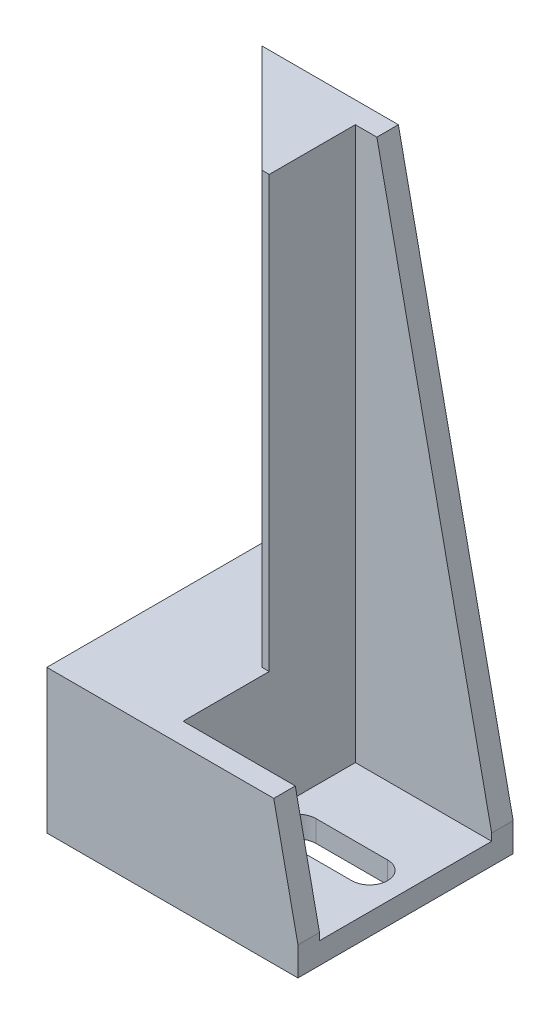
ISO-10303-21;
HEADER;
FILE_DESCRIPTION(('STEP AP214'),'2;1');
FILE_NAME('part.step','',(''),(''),'','','');
FILE_SCHEMA(('AUTOMOTIVE_DESIGN { 1 0 10303 214 1 1 1 1 }'));
ENDSEC;
DATA;
#1=APPLICATION_CONTEXT('core data for automotive mechanical design processes');
#2=APPLICATION_PROTOCOL_DEFINITION('international standard','automotive_design',2000,#1);
#3=PRODUCT_CONTEXT('',#1,'mechanical');
#4=PRODUCT('Part','Part','',(#3));
#5=PRODUCT_RELATED_PRODUCT_CATEGORY('part','',(#4));
#6=PRODUCT_DEFINITION_FORMATION('','',#4);
#7=PRODUCT_DEFINITION_CONTEXT('part definition',#1,'design');
#8=PRODUCT_DEFINITION('design','',#6,#7);
#9=PRODUCT_DEFINITION_SHAPE('','',#8);
#10=(LENGTH_UNIT() NAMED_UNIT(*) SI_UNIT(.MILLI.,.METRE.));
#11=(NAMED_UNIT(*) PLANE_ANGLE_UNIT() SI_UNIT($,.RADIAN.));
#12=(NAMED_UNIT(*) SI_UNIT($,.STERADIAN.) SOLID_ANGLE_UNIT());
#13=UNCERTAINTY_MEASURE_WITH_UNIT(LENGTH_MEASURE(1.E-05),#10,'distance_accuracy_value','');
#14=(GEOMETRIC_REPRESENTATION_CONTEXT(3) GLOBAL_UNCERTAINTY_ASSIGNED_CONTEXT((#13)) GLOBAL_UNIT_ASSIGNED_CONTEXT((#10,
#11,#12)) REPRESENTATION_CONTEXT('',''));
#15=CARTESIAN_POINT('',(0.,0.,0.));
#16=DIRECTION('',(0.,0.,1.));
#17=DIRECTION('',(1.,0.,0.));
#18=AXIS2_PLACEMENT_3D('',#15,#16,#17);
#19=CARTESIAN_POINT('',(-9.525,-26.9407683632074,9.525));
#20=DIRECTION('',(0.707106781186548,0.,-0.707106781186547));
#21=DIRECTION('',(-0.707106781186547,0.,-0.707106781186548));
#22=AXIS2_PLACEMENT_3D('',#19,#20,#21);
#23=PLANE('',#22);
#24=DIRECTION('',(0.707106781186547,0.,0.707106781186548));
#25=VECTOR('',#24,1.);
#26=CARTESIAN_POINT('',(-19.05,25.4,0.));
#27=LINE('',#26,#25);
#28=CARTESIAN_POINT('',(-19.05,25.4,0.));
#29=VERTEX_POINT('',#28);
#30=CARTESIAN_POINT('',(0.,25.4,19.05));
#31=VERTEX_POINT('',#30);
#32=EDGE_CURVE('E172',#29,#31,#27,.T.);
#33=ORIENTED_EDGE('',*,*,#32,.T.);
#34=DIRECTION('',(0.,1.,0.));
#35=VECTOR('',#34,1.);
#36=CARTESIAN_POINT('',(0.,-26.9407683632074,19.05));
#37=LINE('',#36,#35);
#38=CARTESIAN_POINT('',(0.,101.6,19.05));
#39=VERTEX_POINT('',#38);
#40=EDGE_CURVE('E205',#31,#39,#37,.T.);
#41=ORIENTED_EDGE('',*,*,#40,.T.);
#42=DIRECTION('',(-0.707106781186547,0.,-0.707106781186548));
#43=VECTOR('',#42,1.);
#44=CARTESIAN_POINT('',(-9.525,101.6,9.525));
#45=LINE('',#44,#43);
#46=CARTESIAN_POINT('',(-19.05,101.6,0.));
#47=VERTEX_POINT('',#46);
#48=EDGE_CURVE('E166',#39,#47,#45,.T.);
#49=ORIENTED_EDGE('',*,*,#48,.T.);
#50=DIRECTION('',(0.,1.,0.));
#51=VECTOR('',#50,1.);
#52=CARTESIAN_POINT('',(-19.05,-26.9407683632074,0.));
#53=LINE('',#52,#51);
#54=EDGE_CURVE('E204',#29,#47,#53,.T.);
#55=ORIENTED_EDGE('',*,*,#54,.F.);
#56=EDGE_LOOP('',(#33,#41,#49,#55));
#57=FACE_BOUND('',#56,.T.);
#58=ADVANCED_FACE('F35',(#57),#23,.F.);
#59=CARTESIAN_POINT('',(25.4,5.08,38.1));
#60=DIRECTION('',(-0.978549784986749,-0.206010481049842,0.));
#61=DIRECTION('',(0.206010481049842,-0.978549784986749,0.));
#62=AXIS2_PLACEMENT_3D('',#59,#60,#61);
#63=PLANE('',#62);
#64=DIRECTION('',(0.,0.,-1.));
#65=VECTOR('',#64,1.);
#66=CARTESIAN_POINT('',(5.08,101.6,38.1));
#67=LINE('',#66,#65);
#68=CARTESIAN_POINT('',(5.08000000000001,101.6,3.81));
#69=VERTEX_POINT('',#68);
#70=CARTESIAN_POINT('',(5.08,101.6,0.));
#71=VERTEX_POINT('',#70);
#72=EDGE_CURVE('E257',#69,#71,#67,.T.);
#73=ORIENTED_EDGE('',*,*,#72,.F.);
#74=DIRECTION('',(-0.206010481049842,0.978549784986749,0.));
#75=VECTOR('',#74,1.);
#76=CARTESIAN_POINT('',(25.4,5.08,3.81));
#77=LINE('',#76,#75);
#78=CARTESIAN_POINT('',(25.4,5.08,3.81));
#79=VERTEX_POINT('',#78);
#80=EDGE_CURVE('E243',#79,#69,#77,.T.);
#81=ORIENTED_EDGE('',*,*,#80,.F.);
#82=DIRECTION('',(0.,0.,-1.));
#83=VECTOR('',#82,1.);
#84=CARTESIAN_POINT('',(25.4,5.08,38.1));
#85=LINE('',#84,#83);
#86=CARTESIAN_POINT('',(25.4,5.08,0.));
#87=VERTEX_POINT('',#86);
#88=EDGE_CURVE('E267',#79,#87,#85,.T.);
#89=ORIENTED_EDGE('',*,*,#88,.T.);
#90=DIRECTION('',(-0.206010481049842,0.978549784986749,0.));
#91=VECTOR('',#90,1.);
#92=CARTESIAN_POINT('',(25.4,5.08,0.));
#93=LINE('',#92,#91);
#94=EDGE_CURVE('E262',#87,#71,#93,.T.);
#95=ORIENTED_EDGE('',*,*,#94,.T.);
#96=EDGE_LOOP('',(#73,#81,#89,#95));
#97=FACE_BOUND('',#96,.T.);
#98=ADVANCED_FACE('F274',(#97),#63,.F.);
#99=CARTESIAN_POINT('',(0.,3.81,38.1));
#100=DIRECTION('',(0.,1.,0.));
#101=DIRECTION('',(0.,0.,1.));
#102=AXIS2_PLACEMENT_3D('',#99,#100,#101);
#103=PLANE('',#102);
#104=DIRECTION('',(1.,0.,0.));
#105=VECTOR('',#104,1.);
#106=CARTESIAN_POINT('',(0.,3.81,3.81));
#107=LINE('',#106,#105);
#108=CARTESIAN_POINT('',(1.27,3.81,3.81));
#109=VERTEX_POINT('',#108);
#110=CARTESIAN_POINT('',(25.4,3.81,3.81));
#111=VERTEX_POINT('',#110);
#112=EDGE_CURVE('E241',#109,#111,#107,.T.);
#113=ORIENTED_EDGE('',*,*,#112,.F.);
#114=DIRECTION('',(0.,0.,-1.));
#115=VECTOR('',#114,1.);
#116=CARTESIAN_POINT('',(1.27,3.81,3.81));
#117=LINE('',#116,#115);
#118=CARTESIAN_POINT('',(1.27000000000001,3.81,34.29));
#119=VERTEX_POINT('',#118);
#120=EDGE_CURVE('E167',#119,#109,#117,.T.);
#121=ORIENTED_EDGE('',*,*,#120,.F.);
#122=DIRECTION('',(1.,0.,0.));
#123=VECTOR('',#122,1.);
#124=CARTESIAN_POINT('',(0.,3.81,34.29));
#125=LINE('',#124,#123);
#126=CARTESIAN_POINT('',(25.4,3.81,34.29));
#127=VERTEX_POINT('',#126);
#128=EDGE_CURVE('E244',#119,#127,#125,.T.);
#129=ORIENTED_EDGE('',*,*,#128,.T.);
#130=DIRECTION('',(0.,0.,1.));
#131=VECTOR('',#130,1.);
#132=CARTESIAN_POINT('',(25.4,3.81,3.81));
#133=LINE('',#132,#131);
#134=EDGE_CURVE('E181',#111,#127,#133,.T.);
#135=ORIENTED_EDGE('',*,*,#134,.F.);
#136=EDGE_LOOP('',(#113,#121,#129,#135));
#137=FACE_BOUND('',#136,.T.);
#138=CARTESIAN_POINT('',(6.35,3.81,19.05));
#139=DIRECTION('',(0.,1.,0.));
#140=DIRECTION('',(0.,0.,1.));
#141=AXIS2_PLACEMENT_3D('',#138,#139,#140);
#142=CIRCLE('',#141,3.175);
#143=CARTESIAN_POINT('',(6.35,3.81,22.225));
#144=VERTEX_POINT('',#143);
#145=CARTESIAN_POINT('',(6.35,3.81,15.875));
#146=VERTEX_POINT('',#145);
#147=EDGE_CURVE('E226',#144,#146,#142,.F.);
#148=ORIENTED_EDGE('',*,*,#147,.T.);
#149=DIRECTION('',(1.,0.,0.));
#150=VECTOR('',#149,1.);
#151=CARTESIAN_POINT('',(6.35,3.81,15.875));
#152=LINE('',#151,#150);
#153=CARTESIAN_POINT('',(19.05,3.81,15.875));
#154=VERTEX_POINT('',#153);
#155=EDGE_CURVE('E214',#146,#154,#152,.T.);
#156=ORIENTED_EDGE('',*,*,#155,.T.);
#157=CARTESIAN_POINT('',(19.05,3.81,19.05));
#158=DIRECTION('',(0.,1.,0.));
#159=DIRECTION('',(0.,0.,1.));
#160=AXIS2_PLACEMENT_3D('',#157,#158,#159);
#161=CIRCLE('',#160,3.175);
#162=CARTESIAN_POINT('',(19.05,3.81,22.225));
#163=VERTEX_POINT('',#162);
#164=EDGE_CURVE('E234',#154,#163,#161,.F.);
#165=ORIENTED_EDGE('',*,*,#164,.T.);
#166=DIRECTION('',(-1.,0.,0.));
#167=VECTOR('',#166,1.);
#168=CARTESIAN_POINT('',(6.35,3.81,22.225));
#169=LINE('',#168,#167);
#170=EDGE_CURVE('E230',#163,#144,#169,.T.);
#171=ORIENTED_EDGE('',*,*,#170,.T.);
#172=EDGE_LOOP('',(#148,#156,#165,#171));
#173=FACE_BOUND('',#172,.T.);
#174=ADVANCED_FACE('F312',(#137,#173),#103,.T.);
#175=DIRECTION('',(-0.206010481049842,0.978549784986749,0.));
#176=VECTOR('',#175,1.);
#177=CARTESIAN_POINT('',(25.4,5.08,34.29));
#178=LINE('',#177,#176);
#179=CARTESIAN_POINT('',(25.4,5.08,34.29));
#180=VERTEX_POINT('',#179);
#181=CARTESIAN_POINT('',(21.1221052631579,25.4,34.29));
#182=VERTEX_POINT('',#181);
#183=EDGE_CURVE('E246',#180,#182,#178,.T.);
#184=ORIENTED_EDGE('',*,*,#183,.T.);
#185=DIRECTION('',(0.,0.,1.));
#186=VECTOR('',#185,1.);
#187=CARTESIAN_POINT('',(21.1221052631579,25.4,38.1));
#188=LINE('',#187,#186);
#189=CARTESIAN_POINT('',(21.1221052631579,25.4,38.1));
#190=VERTEX_POINT('',#189);
#191=EDGE_CURVE('E176',#182,#190,#188,.T.);
#192=ORIENTED_EDGE('',*,*,#191,.T.);
#193=DIRECTION('',(-0.206010481049842,0.978549784986749,0.));
#194=VECTOR('',#193,1.);
#195=CARTESIAN_POINT('',(25.4,5.08,38.1));
#196=LINE('',#195,#194);
#197=CARTESIAN_POINT('',(25.4,5.08,38.1));
#198=VERTEX_POINT('',#197);
#199=EDGE_CURVE('E157',#198,#190,#196,.T.);
#200=ORIENTED_EDGE('',*,*,#199,.F.);
#201=EDGE_CURVE('E43',#198,#180,#85,.T.);
#202=ORIENTED_EDGE('',*,*,#201,.T.);
#203=EDGE_LOOP('',(#184,#192,#200,#202));
#204=FACE_BOUND('',#203,.T.);
#205=ADVANCED_FACE('F303',(#204),#63,.F.);
#206=CARTESIAN_POINT('',(0.,0.,38.1));
#207=DIRECTION('',(0.,1.,0.));
#208=DIRECTION('',(0.,0.,1.));
#209=AXIS2_PLACEMENT_3D('',#206,#207,#208);
#210=PLANE('',#209);
#211=CARTESIAN_POINT('',(19.05,0.,19.05));
#212=DIRECTION('',(0.,-1.,0.));
#213=DIRECTION('',(0.,0.,-1.));
#214=AXIS2_PLACEMENT_3D('',#211,#212,#213);
#215=CIRCLE('',#214,3.175);
#216=CARTESIAN_POINT('',(19.05,0.,15.875));
#217=VERTEX_POINT('',#216);
#218=CARTESIAN_POINT('',(19.05,0.,22.225));
#219=VERTEX_POINT('',#218);
#220=EDGE_CURVE('E215',#217,#219,#215,.T.);
#221=ORIENTED_EDGE('',*,*,#220,.F.);
#222=DIRECTION('',(1.,0.,0.));
#223=VECTOR('',#222,1.);
#224=CARTESIAN_POINT('',(6.35,0.,15.875));
#225=LINE('',#224,#223);
#226=CARTESIAN_POINT('',(6.35,0.,15.875));
#227=VERTEX_POINT('',#226);
#228=EDGE_CURVE('E218',#227,#217,#225,.T.);
#229=ORIENTED_EDGE('',*,*,#228,.F.);
#230=CARTESIAN_POINT('',(6.35,0.,19.05));
#231=DIRECTION('',(0.,-1.,0.));
#232=DIRECTION('',(0.,0.,-1.));
#233=AXIS2_PLACEMENT_3D('',#230,#231,#232);
#234=CIRCLE('',#233,3.175);
#235=CARTESIAN_POINT('',(6.35,0.,22.225));
#236=VERTEX_POINT('',#235);
#237=EDGE_CURVE('E208',#236,#227,#234,.T.);
#238=ORIENTED_EDGE('',*,*,#237,.F.);
#239=DIRECTION('',(-1.,0.,0.));
#240=VECTOR('',#239,1.);
#241=CARTESIAN_POINT('',(6.35,0.,22.225));
#242=LINE('',#241,#240);
#243=EDGE_CURVE('E212',#219,#236,#242,.T.);
#244=ORIENTED_EDGE('',*,*,#243,.F.);
#245=EDGE_LOOP('',(#221,#229,#238,#244));
#246=FACE_BOUND('',#245,.T.);
#247=DIRECTION('',(1.,0.,0.));
#248=VECTOR('',#247,1.);
#249=CARTESIAN_POINT('',(0.,0.,0.));
#250=LINE('',#249,#248);
#251=CARTESIAN_POINT('',(-19.05,0.,0.));
#252=VERTEX_POINT('',#251);
#253=CARTESIAN_POINT('',(25.4,0.,0.));
#254=VERTEX_POINT('',#253);
#255=EDGE_CURVE('E250',#252,#254,#250,.T.);
#256=ORIENTED_EDGE('',*,*,#255,.T.);
#257=DIRECTION('',(0.,0.,-1.));
#258=VECTOR('',#257,1.);
#259=CARTESIAN_POINT('',(25.4,0.,38.1));
#260=LINE('',#259,#258);
#261=CARTESIAN_POINT('',(25.4,0.,38.1));
#262=VERTEX_POINT('',#261);
#263=EDGE_CURVE('E11',#262,#254,#260,.T.);
#264=ORIENTED_EDGE('',*,*,#263,.F.);
#265=DIRECTION('',(1.,0.,0.));
#266=VECTOR('',#265,1.);
#267=CARTESIAN_POINT('',(0.,0.,38.1));
#268=LINE('',#267,#266);
#269=CARTESIAN_POINT('',(-19.05,0.,38.1));
#270=VERTEX_POINT('',#269);
#271=EDGE_CURVE('E251',#270,#262,#268,.T.);
#272=ORIENTED_EDGE('',*,*,#271,.F.);
#273=DIRECTION('',(0.,0.,-1.));
#274=VECTOR('',#273,1.);
#275=CARTESIAN_POINT('',(-19.05,0.,38.1));
#276=LINE('',#275,#274);
#277=EDGE_CURVE('E165',#270,#252,#276,.T.);
#278=ORIENTED_EDGE('',*,*,#277,.T.);
#279=EDGE_LOOP('',(#256,#264,#272,#278));
#280=FACE_BOUND('',#279,.T.);
#281=ADVANCED_FACE('F37',(#246,#280),#210,.F.);
#282=CARTESIAN_POINT('',(25.4,0.,38.1));
#283=DIRECTION('',(-1.,0.,0.));
#284=DIRECTION('',(0.,0.,1.));
#285=AXIS2_PLACEMENT_3D('',#282,#283,#284);
#286=PLANE('',#285);
#287=ORIENTED_EDGE('',*,*,#88,.F.);
#288=DIRECTION('',(0.,1.,0.));
#289=VECTOR('',#288,1.);
#290=CARTESIAN_POINT('',(25.4,-35.0652787771354,3.81));
#291=LINE('',#290,#289);
#292=EDGE_CURVE('E184',#111,#79,#291,.T.);
#293=ORIENTED_EDGE('',*,*,#292,.F.);
#294=ORIENTED_EDGE('',*,*,#134,.T.);
#295=DIRECTION('',(0.,1.,0.));
#296=VECTOR('',#295,1.);
#297=CARTESIAN_POINT('',(25.4,-35.0652787771354,34.29));
#298=LINE('',#297,#296);
#299=EDGE_CURVE('E192',#127,#180,#298,.T.);
#300=ORIENTED_EDGE('',*,*,#299,.T.);
#301=ORIENTED_EDGE('',*,*,#201,.F.);
#302=DIRECTION('',(0.,1.,0.));
#303=VECTOR('',#302,1.);
#304=CARTESIAN_POINT('',(25.4,0.,38.1));
#305=LINE('',#304,#303);
#306=EDGE_CURVE('E253',#262,#198,#305,.T.);
#307=ORIENTED_EDGE('',*,*,#306,.F.);
#308=ORIENTED_EDGE('',*,*,#263,.T.);
#309=DIRECTION('',(0.,1.,0.));
#310=VECTOR('',#309,1.);
#311=CARTESIAN_POINT('',(25.4,0.,0.));
#312=LINE('',#311,#310);
#313=EDGE_CURVE('E259',#254,#87,#312,.T.);
#314=ORIENTED_EDGE('',*,*,#313,.T.);
#315=EDGE_LOOP('',(#287,#293,#294,#300,#301,#307,#308,#314));
#316=FACE_BOUND('',#315,.T.);
#317=ADVANCED_FACE('F280',(#316),#286,.F.);
#318=CARTESIAN_POINT('',(5.08,101.6,38.1));
#319=DIRECTION('',(0.,-1.,0.));
#320=DIRECTION('',(0.,0.,-1.));
#321=AXIS2_PLACEMENT_3D('',#318,#319,#320);
#322=PLANE('',#321);
#323=ORIENTED_EDGE('',*,*,#48,.F.);
#324=DIRECTION('',(-1.,0.,0.));
#325=VECTOR('',#324,1.);
#326=CARTESIAN_POINT('',(-19.05,101.6,19.05));
#327=LINE('',#326,#325);
#328=CARTESIAN_POINT('',(1.27,101.6,19.05));
#329=VERTEX_POINT('',#328);
#330=EDGE_CURVE('E160',#329,#39,#327,.T.);
#331=ORIENTED_EDGE('',*,*,#330,.F.);
#332=DIRECTION('',(0.,0.,1.));
#333=VECTOR('',#332,1.);
#334=CARTESIAN_POINT('',(1.27,101.6,3.81));
#335=LINE('',#334,#333);
#336=CARTESIAN_POINT('',(1.27,101.6,3.81));
#337=VERTEX_POINT('',#336);
#338=EDGE_CURVE('E186',#337,#329,#335,.T.);
#339=ORIENTED_EDGE('',*,*,#338,.F.);
#340=DIRECTION('',(-1.,0.,0.));
#341=VECTOR('',#340,1.);
#342=CARTESIAN_POINT('',(25.4,101.6,3.81));
#343=LINE('',#342,#341);
#344=EDGE_CURVE('E174',#69,#337,#343,.T.);
#345=ORIENTED_EDGE('',*,*,#344,.F.);
#346=ORIENTED_EDGE('',*,*,#72,.T.);
#347=DIRECTION('',(-1.,0.,0.));
#348=VECTOR('',#347,1.);
#349=CARTESIAN_POINT('',(5.08,101.6,0.));
#350=LINE('',#349,#348);
#351=EDGE_CURVE('E254',#71,#47,#350,.T.);
#352=ORIENTED_EDGE('',*,*,#351,.T.);
#353=EDGE_LOOP('',(#323,#331,#339,#345,#346,#352));
#354=FACE_BOUND('',#353,.T.);
#355=ADVANCED_FACE('F287',(#354),#322,.F.);
#356=CARTESIAN_POINT('',(0.,0.,38.1));
#357=DIRECTION('',(0.,0.,1.));
#358=DIRECTION('',(1.,0.,0.));
#359=AXIS2_PLACEMENT_3D('',#356,#357,#358);
#360=PLANE('',#359);
#361=DIRECTION('',(1.,0.,0.));
#362=VECTOR('',#361,1.);
#363=CARTESIAN_POINT('',(-19.05,25.4,38.1));
#364=LINE('',#363,#362);
#365=CARTESIAN_POINT('',(-19.05,25.4,38.1));
#366=VERTEX_POINT('',#365);
#367=EDGE_CURVE('E152',#366,#190,#364,.T.);
#368=ORIENTED_EDGE('',*,*,#367,.F.);
#369=DIRECTION('',(0.,1.,0.));
#370=VECTOR('',#369,1.);
#371=CARTESIAN_POINT('',(-19.05,-26.9407683632074,38.1));
#372=LINE('',#371,#370);
#373=EDGE_CURVE('E154',#270,#366,#372,.T.);
#374=ORIENTED_EDGE('',*,*,#373,.F.);
#375=ORIENTED_EDGE('',*,*,#271,.T.);
#376=ORIENTED_EDGE('',*,*,#306,.T.);
#377=ORIENTED_EDGE('',*,*,#199,.T.);
#378=EDGE_LOOP('',(#368,#374,#375,#376,#377));
#379=FACE_BOUND('',#378,.T.);
#380=ADVANCED_FACE('F153',(#379),#360,.T.);
#381=CARTESIAN_POINT('',(0.,0.,0.));
#382=DIRECTION('',(0.,0.,1.));
#383=DIRECTION('',(1.,0.,0.));
#384=AXIS2_PLACEMENT_3D('',#381,#382,#383);
#385=PLANE('',#384);
#386=ORIENTED_EDGE('',*,*,#255,.F.);
#387=EDGE_CURVE('E209',#252,#29,#53,.T.);
#388=ORIENTED_EDGE('',*,*,#387,.T.);
#389=ORIENTED_EDGE('',*,*,#54,.T.);
#390=ORIENTED_EDGE('',*,*,#351,.F.);
#391=ORIENTED_EDGE('',*,*,#94,.F.);
#392=ORIENTED_EDGE('',*,*,#313,.F.);
#393=EDGE_LOOP('',(#386,#388,#389,#390,#391,#392));
#394=FACE_BOUND('',#393,.T.);
#395=ADVANCED_FACE('F284',(#394),#385,.F.);
#396=CARTESIAN_POINT('',(0.,0.,34.29));
#397=DIRECTION('',(0.,0.,1.));
#398=DIRECTION('',(1.,0.,0.));
#399=AXIS2_PLACEMENT_3D('',#396,#397,#398);
#400=PLANE('',#399);
#401=DIRECTION('',(0.,1.,0.));
#402=VECTOR('',#401,1.);
#403=CARTESIAN_POINT('',(1.27000000000001,-35.0652787771354,34.29));
#404=LINE('',#403,#402);
#405=CARTESIAN_POINT('',(1.27000000000001,25.4,34.29));
#406=VERTEX_POINT('',#405);
#407=EDGE_CURVE('E195',#119,#406,#404,.T.);
#408=ORIENTED_EDGE('',*,*,#407,.T.);
#409=DIRECTION('',(1.,0.,0.));
#410=VECTOR('',#409,1.);
#411=CARTESIAN_POINT('',(0.,25.4,34.29));
#412=LINE('',#411,#410);
#413=EDGE_CURVE('E300',#406,#182,#412,.T.);
#414=ORIENTED_EDGE('',*,*,#413,.T.);
#415=ORIENTED_EDGE('',*,*,#183,.F.);
#416=ORIENTED_EDGE('',*,*,#299,.F.);
#417=ORIENTED_EDGE('',*,*,#128,.F.);
#418=EDGE_LOOP('',(#408,#414,#415,#416,#417));
#419=FACE_BOUND('',#418,.T.);
#420=ADVANCED_FACE('F308',(#419),#400,.F.);
#421=CARTESIAN_POINT('',(0.,0.,3.81));
#422=DIRECTION('',(0.,0.,1.));
#423=DIRECTION('',(1.,0.,0.));
#424=AXIS2_PLACEMENT_3D('',#421,#422,#423);
#425=PLANE('',#424);
#426=DIRECTION('',(0.,1.,0.));
#427=VECTOR('',#426,1.);
#428=CARTESIAN_POINT('',(1.27,-35.0652787771354,3.81));
#429=LINE('',#428,#427);
#430=EDGE_CURVE('E189',#109,#337,#429,.T.);
#431=ORIENTED_EDGE('',*,*,#430,.F.);
#432=ORIENTED_EDGE('',*,*,#112,.T.);
#433=ORIENTED_EDGE('',*,*,#292,.T.);
#434=ORIENTED_EDGE('',*,*,#80,.T.);
#435=ORIENTED_EDGE('',*,*,#344,.T.);
#436=EDGE_LOOP('',(#431,#432,#433,#434,#435));
#437=FACE_BOUND('',#436,.T.);
#438=ADVANCED_FACE('F317',(#437),#425,.T.);
#439=CARTESIAN_POINT('',(6.35,23.8904631420692,15.875));
#440=DIRECTION('',(0.,0.,-1.));
#441=DIRECTION('',(-1.,0.,0.));
#442=AXIS2_PLACEMENT_3D('',#439,#440,#441);
#443=PLANE('',#442);
#444=DIRECTION('',(0.,-1.,0.));
#445=VECTOR('',#444,1.);
#446=CARTESIAN_POINT('',(6.35,23.8904631420692,15.875));
#447=LINE('',#446,#445);
#448=EDGE_CURVE('E228',#146,#227,#447,.T.);
#449=ORIENTED_EDGE('',*,*,#448,.T.);
#450=ORIENTED_EDGE('',*,*,#228,.T.);
#451=DIRECTION('',(0.,-1.,0.));
#452=VECTOR('',#451,1.);
#453=CARTESIAN_POINT('',(19.05,23.8904631420692,15.875));
#454=LINE('',#453,#452);
#455=EDGE_CURVE('E225',#154,#217,#454,.T.);
#456=ORIENTED_EDGE('',*,*,#455,.F.);
#457=ORIENTED_EDGE('',*,*,#155,.F.);
#458=EDGE_LOOP('',(#449,#450,#456,#457));
#459=FACE_BOUND('',#458,.T.);
#460=ADVANCED_FACE('F346',(#459),#443,.F.);
#461=CARTESIAN_POINT('',(19.05,23.8904631420692,19.05));
#462=DIRECTION('',(0.,-1.,0.));
#463=DIRECTION('',(0.,0.,-1.));
#464=AXIS2_PLACEMENT_3D('',#461,#462,#463);
#465=CYLINDRICAL_SURFACE('',#464,3.175);
#466=ORIENTED_EDGE('',*,*,#455,.T.);
#467=ORIENTED_EDGE('',*,*,#220,.T.);
#468=DIRECTION('',(0.,-1.,0.));
#469=VECTOR('',#468,1.);
#470=CARTESIAN_POINT('',(19.05,23.8904631420692,22.225));
#471=LINE('',#470,#469);
#472=EDGE_CURVE('E233',#163,#219,#471,.T.);
#473=ORIENTED_EDGE('',*,*,#472,.F.);
#474=ORIENTED_EDGE('',*,*,#164,.F.);
#475=EDGE_LOOP('',(#466,#467,#473,#474));
#476=FACE_BOUND('',#475,.T.);
#477=ADVANCED_FACE('F342',(#476),#465,.F.);
#478=CARTESIAN_POINT('',(6.35,23.8904631420692,22.225));
#479=DIRECTION('',(0.,0.,1.));
#480=DIRECTION('',(1.,0.,0.));
#481=AXIS2_PLACEMENT_3D('',#478,#479,#480);
#482=PLANE('',#481);
#483=ORIENTED_EDGE('',*,*,#472,.T.);
#484=ORIENTED_EDGE('',*,*,#243,.T.);
#485=DIRECTION('',(0.,-1.,0.));
#486=VECTOR('',#485,1.);
#487=CARTESIAN_POINT('',(6.35,23.8904631420692,22.225));
#488=LINE('',#487,#486);
#489=EDGE_CURVE('E229',#144,#236,#488,.T.);
#490=ORIENTED_EDGE('',*,*,#489,.F.);
#491=ORIENTED_EDGE('',*,*,#170,.F.);
#492=EDGE_LOOP('',(#483,#484,#490,#491));
#493=FACE_BOUND('',#492,.T.);
#494=ADVANCED_FACE('F338',(#493),#482,.F.);
#495=CARTESIAN_POINT('',(6.35,23.8904631420692,19.05));
#496=DIRECTION('',(0.,-1.,0.));
#497=DIRECTION('',(0.,0.,-1.));
#498=AXIS2_PLACEMENT_3D('',#495,#496,#497);
#499=CYLINDRICAL_SURFACE('',#498,3.175);
#500=ORIENTED_EDGE('',*,*,#489,.T.);
#501=ORIENTED_EDGE('',*,*,#237,.T.);
#502=ORIENTED_EDGE('',*,*,#448,.F.);
#503=ORIENTED_EDGE('',*,*,#147,.F.);
#504=EDGE_LOOP('',(#500,#501,#502,#503));
#505=FACE_BOUND('',#504,.T.);
#506=ADVANCED_FACE('F335',(#505),#499,.F.);
#507=CARTESIAN_POINT('',(1.27,-35.0652787771354,3.81));
#508=DIRECTION('',(-1.,0.,0.));
#509=DIRECTION('',(0.,0.,1.));
#510=AXIS2_PLACEMENT_3D('',#507,#508,#509);
#511=PLANE('',#510);
#512=DIRECTION('',(0.,-1.,0.));
#513=VECTOR('',#512,1.);
#514=CARTESIAN_POINT('',(1.27,-35.0652787771354,19.05));
#515=LINE('',#514,#513);
#516=CARTESIAN_POINT('',(1.27,25.4,19.05));
#517=VERTEX_POINT('',#516);
#518=EDGE_CURVE('E295',#329,#517,#515,.T.);
#519=ORIENTED_EDGE('',*,*,#518,.T.);
#520=DIRECTION('',(0.,0.,1.));
#521=VECTOR('',#520,1.);
#522=CARTESIAN_POINT('',(1.27,25.4,3.81));
#523=LINE('',#522,#521);
#524=EDGE_CURVE('E293',#517,#406,#523,.T.);
#525=ORIENTED_EDGE('',*,*,#524,.T.);
#526=ORIENTED_EDGE('',*,*,#407,.F.);
#527=ORIENTED_EDGE('',*,*,#120,.T.);
#528=ORIENTED_EDGE('',*,*,#430,.T.);
#529=ORIENTED_EDGE('',*,*,#338,.T.);
#530=EDGE_LOOP('',(#519,#525,#526,#527,#528,#529));
#531=FACE_BOUND('',#530,.T.);
#532=ADVANCED_FACE('F306',(#531),#511,.F.);
#533=CARTESIAN_POINT('',(-19.05,25.4,38.1));
#534=DIRECTION('',(-1.,0.,0.));
#535=DIRECTION('',(0.,0.,1.));
#536=AXIS2_PLACEMENT_3D('',#533,#534,#535);
#537=PLANE('',#536);
#538=ORIENTED_EDGE('',*,*,#277,.F.);
#539=ORIENTED_EDGE('',*,*,#373,.T.);
#540=DIRECTION('',(0.,0.,-1.));
#541=VECTOR('',#540,1.);
#542=CARTESIAN_POINT('',(-19.05,25.4,38.1));
#543=LINE('',#542,#541);
#544=EDGE_CURVE('E58',#366,#29,#543,.T.);
#545=ORIENTED_EDGE('',*,*,#544,.T.);
#546=ORIENTED_EDGE('',*,*,#387,.F.);
#547=EDGE_LOOP('',(#538,#539,#545,#546));
#548=FACE_BOUND('',#547,.T.);
#549=ADVANCED_FACE('F163',(#548),#537,.T.);
#550=CARTESIAN_POINT('',(0.,25.4,0.));
#551=DIRECTION('',(0.,-1.,0.));
#552=DIRECTION('',(0.,0.,-1.));
#553=AXIS2_PLACEMENT_3D('',#550,#551,#552);
#554=PLANE('',#553);
#555=ORIENTED_EDGE('',*,*,#32,.F.);
#556=ORIENTED_EDGE('',*,*,#544,.F.);
#557=ORIENTED_EDGE('',*,*,#367,.T.);
#558=ORIENTED_EDGE('',*,*,#191,.F.);
#559=ORIENTED_EDGE('',*,*,#413,.F.);
#560=ORIENTED_EDGE('',*,*,#524,.F.);
#561=DIRECTION('',(-1.,0.,0.));
#562=VECTOR('',#561,1.);
#563=CARTESIAN_POINT('',(-19.05,25.4,19.05));
#564=LINE('',#563,#562);
#565=EDGE_CURVE('E50',#517,#31,#564,.T.);
#566=ORIENTED_EDGE('',*,*,#565,.T.);
#567=EDGE_LOOP('',(#555,#556,#557,#558,#559,#560,#566));
#568=FACE_BOUND('',#567,.T.);
#569=ADVANCED_FACE('F170',(#568),#554,.F.);
#570=CARTESIAN_POINT('',(-19.05,-22.9601592222358,19.05));
#571=DIRECTION('',(0.,0.,-1.));
#572=DIRECTION('',(-1.,0.,0.));
#573=AXIS2_PLACEMENT_3D('',#570,#571,#572);
#574=PLANE('',#573);
#575=ORIENTED_EDGE('',*,*,#565,.F.);
#576=ORIENTED_EDGE('',*,*,#518,.F.);
#577=ORIENTED_EDGE('',*,*,#330,.T.);
#578=ORIENTED_EDGE('',*,*,#40,.F.);
#579=EDGE_LOOP('',(#575,#576,#577,#578));
#580=FACE_BOUND('',#579,.T.);
#581=ADVANCED_FACE('F291',(#580),#574,.F.);
#582=CLOSED_SHELL('',(#58,#98,#174,#205,#281,#317,#355,#380,#395,#420,#438,#460,#477,#494,#506,
#532,#549,#569,#581));
#583=MANIFOLD_SOLID_BREP('B2',#582);
#584=ADVANCED_BREP_SHAPE_REPRESENTATION('',(#18,#583),#14);
#585=SHAPE_DEFINITION_REPRESENTATION(#9,#584);
ENDSEC;
END-ISO-10303-21;
